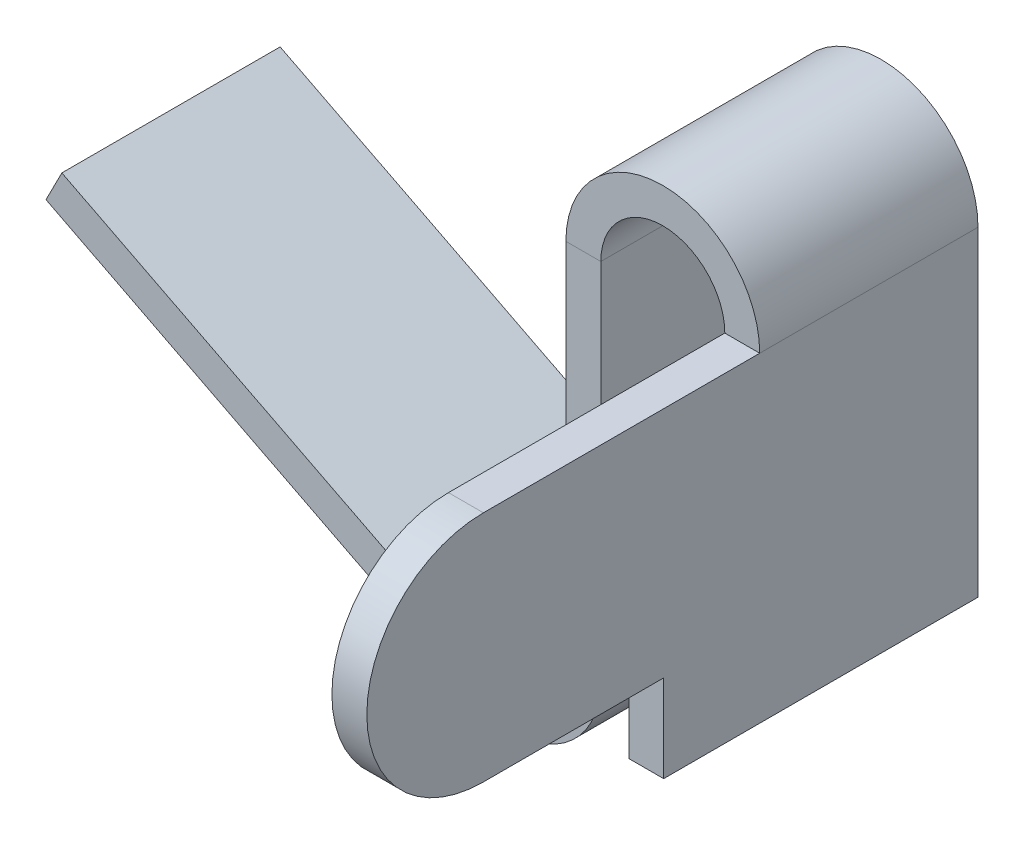
ISO-10303-21;
HEADER;
FILE_DESCRIPTION(('STEP AP214'),'2;1');
FILE_NAME('part.step','',(''),(''),'','','');
FILE_SCHEMA(('AUTOMOTIVE_DESIGN { 1 0 10303 214 1 1 1 1 }'));
ENDSEC;
DATA;
#1=APPLICATION_CONTEXT('core data for automotive mechanical design processes');
#2=APPLICATION_PROTOCOL_DEFINITION('international standard','automotive_design',2000,#1);
#3=PRODUCT_CONTEXT('',#1,'mechanical');
#4=PRODUCT('Part','Part','',(#3));
#5=PRODUCT_RELATED_PRODUCT_CATEGORY('part','',(#4));
#6=PRODUCT_DEFINITION_FORMATION('','',#4);
#7=PRODUCT_DEFINITION_CONTEXT('part definition',#1,'design');
#8=PRODUCT_DEFINITION('design','',#6,#7);
#9=PRODUCT_DEFINITION_SHAPE('','',#8);
#10=(LENGTH_UNIT() NAMED_UNIT(*) SI_UNIT(.MILLI.,.METRE.));
#11=(NAMED_UNIT(*) PLANE_ANGLE_UNIT() SI_UNIT($,.RADIAN.));
#12=(NAMED_UNIT(*) SI_UNIT($,.STERADIAN.) SOLID_ANGLE_UNIT());
#13=UNCERTAINTY_MEASURE_WITH_UNIT(LENGTH_MEASURE(1.E-05),#10,'distance_accuracy_value','');
#14=(GEOMETRIC_REPRESENTATION_CONTEXT(3) GLOBAL_UNCERTAINTY_ASSIGNED_CONTEXT((#13)) GLOBAL_UNIT_ASSIGNED_CONTEXT((#10,
#11,#12)) REPRESENTATION_CONTEXT('',''));
#15=CARTESIAN_POINT('',(0.,0.,0.));
#16=DIRECTION('',(0.,0.,1.));
#17=DIRECTION('',(1.,0.,0.));
#18=AXIS2_PLACEMENT_3D('',#15,#16,#17);
#19=CARTESIAN_POINT('',(1.11,0.5,5.665));
#20=DIRECTION('',(-1.,0.,0.));
#21=DIRECTION('',(0.,0.,1.));
#22=AXIS2_PLACEMENT_3D('',#19,#20,#21);
#23=CYLINDRICAL_SURFACE('',#22,1.335);
#24=DIRECTION('',(1.,0.,0.));
#25=VECTOR('',#24,1.);
#26=CARTESIAN_POINT('',(1.11,-0.835,5.665));
#27=LINE('',#26,#25);
#28=CARTESIAN_POINT('',(1.11,-0.835,5.665));
#29=VERTEX_POINT('',#28);
#30=CARTESIAN_POINT('',(0.710000000000001,-0.835,5.665));
#31=VERTEX_POINT('',#30);
#32=EDGE_CURVE('E238',#29,#31,#27,.F.);
#33=ORIENTED_EDGE('',*,*,#32,.F.);
#34=CARTESIAN_POINT('',(1.11,0.5,5.665));
#35=DIRECTION('',(-1.,0.,0.));
#36=DIRECTION('',(0.,0.,1.));
#37=AXIS2_PLACEMENT_3D('',#34,#35,#36);
#38=CIRCLE('',#37,1.335);
#39=CARTESIAN_POINT('',(1.11,1.835,5.665));
#40=VERTEX_POINT('',#39);
#41=EDGE_CURVE('E55',#40,#29,#38,.F.);
#42=ORIENTED_EDGE('',*,*,#41,.F.);
#43=DIRECTION('',(1.,0.,0.));
#44=VECTOR('',#43,1.);
#45=CARTESIAN_POINT('',(1.11,1.835,5.665));
#46=LINE('',#45,#44);
#47=CARTESIAN_POINT('',(0.710000000000001,1.835,5.665));
#48=VERTEX_POINT('',#47);
#49=EDGE_CURVE('E242',#48,#40,#46,.T.);
#50=ORIENTED_EDGE('',*,*,#49,.F.);
#51=CARTESIAN_POINT('',(0.710000000000001,0.5,5.665));
#52=DIRECTION('',(-1.,0.,0.));
#53=DIRECTION('',(0.,0.,1.));
#54=AXIS2_PLACEMENT_3D('',#51,#52,#53);
#55=CIRCLE('',#54,1.335);
#56=EDGE_CURVE('E11',#31,#48,#55,.T.);
#57=ORIENTED_EDGE('',*,*,#56,.F.);
#58=EDGE_LOOP('',(#33,#42,#50,#57));
#59=FACE_BOUND('',#58,.T.);
#60=ADVANCED_FACE('F46',(#59),#23,.T.);
#61=CARTESIAN_POINT('',(-0.710000000000001,1.835,2.5));
#62=DIRECTION('',(0.,0.,1.));
#63=DIRECTION('',(1.,0.,0.));
#64=AXIS2_PLACEMENT_3D('',#61,#62,#63);
#65=PLANE('',#64);
#66=DIRECTION('',(-1.,0.,0.));
#67=VECTOR('',#66,1.);
#68=CARTESIAN_POINT('',(-0.710000000000001,1.835,2.5));
#69=LINE('',#68,#67);
#70=CARTESIAN_POINT('',(-0.710000000000001,1.835,2.5));
#71=VERTEX_POINT('',#70);
#72=CARTESIAN_POINT('',(-1.11,1.835,2.5));
#73=VERTEX_POINT('',#72);
#74=EDGE_CURVE('E235',#71,#73,#69,.T.);
#75=ORIENTED_EDGE('',*,*,#74,.F.);
#76=CARTESIAN_POINT('',(0.,1.835,2.5));
#77=DIRECTION('',(0.,0.,1.));
#78=DIRECTION('',(1.,0.,0.));
#79=AXIS2_PLACEMENT_3D('',#76,#77,#78);
#80=CIRCLE('',#79,0.710000000000001);
#81=CARTESIAN_POINT('',(0.710000000000001,1.835,2.5));
#82=VERTEX_POINT('',#81);
#83=EDGE_CURVE('E285',#82,#71,#80,.T.);
#84=ORIENTED_EDGE('',*,*,#83,.F.);
#85=DIRECTION('',(-1.,0.,0.));
#86=VECTOR('',#85,1.);
#87=CARTESIAN_POINT('',(1.11,1.835,2.5));
#88=LINE('',#87,#86);
#89=CARTESIAN_POINT('',(1.11,1.835,2.5));
#90=VERTEX_POINT('',#89);
#91=EDGE_CURVE('E231',#90,#82,#88,.T.);
#92=ORIENTED_EDGE('',*,*,#91,.F.);
#93=CARTESIAN_POINT('',(0.,1.835,2.5));
#94=DIRECTION('',(0.,0.,1.));
#95=DIRECTION('',(1.,0.,0.));
#96=AXIS2_PLACEMENT_3D('',#93,#94,#95);
#97=CIRCLE('',#96,1.11);
#98=EDGE_CURVE('E289',#90,#73,#97,.T.);
#99=ORIENTED_EDGE('',*,*,#98,.T.);
#100=EDGE_LOOP('',(#75,#84,#92,#99));
#101=FACE_BOUND('',#100,.T.);
#102=ADVANCED_FACE('F403',(#101),#65,.T.);
#103=CARTESIAN_POINT('',(1.11,1.835,2.5));
#104=DIRECTION('',(0.,0.,1.));
#105=DIRECTION('',(1.,0.,0.));
#106=AXIS2_PLACEMENT_3D('',#103,#104,#105);
#107=PLANE('',#106);
#108=DIRECTION('',(0.,-1.,0.));
#109=VECTOR('',#108,1.);
#110=CARTESIAN_POINT('',(-0.710000000000001,1.835,2.5));
#111=LINE('',#110,#109);
#112=CARTESIAN_POINT('',(-0.710000000000001,-2.335,2.5));
#113=VERTEX_POINT('',#112);
#114=EDGE_CURVE('E281',#71,#113,#111,.T.);
#115=ORIENTED_EDGE('',*,*,#114,.F.);
#116=ORIENTED_EDGE('',*,*,#74,.T.);
#117=DIRECTION('',(0.,1.,0.));
#118=VECTOR('',#117,1.);
#119=CARTESIAN_POINT('',(-1.11,1.835,2.5));
#120=LINE('',#119,#118);
#121=CARTESIAN_POINT('',(-1.11,-2.335,2.5));
#122=VERTEX_POINT('',#121);
#123=EDGE_CURVE('E293',#73,#122,#120,.F.);
#124=ORIENTED_EDGE('',*,*,#123,.T.);
#125=DIRECTION('',(1.,0.,0.));
#126=VECTOR('',#125,1.);
#127=CARTESIAN_POINT('',(-1.11,-2.335,2.5));
#128=LINE('',#127,#126);
#129=EDGE_CURVE('E219',#122,#113,#128,.T.);
#130=ORIENTED_EDGE('',*,*,#129,.T.);
#131=EDGE_LOOP('',(#115,#116,#124,#130));
#132=FACE_BOUND('',#131,.T.);
#133=ADVANCED_FACE('F399',(#132),#107,.T.);
#134=CARTESIAN_POINT('',(0.710000000000001,1.835,0.));
#135=DIRECTION('',(0.,0.,-1.));
#136=DIRECTION('',(-1.,0.,0.));
#137=AXIS2_PLACEMENT_3D('',#134,#135,#136);
#138=PLANE('',#137);
#139=DIRECTION('',(1.,0.,0.));
#140=VECTOR('',#139,1.);
#141=CARTESIAN_POINT('',(0.710000000000001,1.835,0.));
#142=LINE('',#141,#140);
#143=CARTESIAN_POINT('',(0.710000000000001,1.835,0.));
#144=VERTEX_POINT('',#143);
#145=CARTESIAN_POINT('',(1.11,1.835,0.));
#146=VERTEX_POINT('',#145);
#147=EDGE_CURVE('E228',#144,#146,#142,.T.);
#148=ORIENTED_EDGE('',*,*,#147,.F.);
#149=CARTESIAN_POINT('',(0.,1.835,0.));
#150=DIRECTION('',(0.,0.,1.));
#151=DIRECTION('',(1.,0.,0.));
#152=AXIS2_PLACEMENT_3D('',#149,#150,#151);
#153=CIRCLE('',#152,0.710000000000001);
#154=CARTESIAN_POINT('',(-0.710000000000001,1.835,0.));
#155=VERTEX_POINT('',#154);
#156=EDGE_CURVE('E321',#144,#155,#153,.T.);
#157=ORIENTED_EDGE('',*,*,#156,.T.);
#158=DIRECTION('',(1.,0.,0.));
#159=VECTOR('',#158,1.);
#160=CARTESIAN_POINT('',(-1.11,1.835,0.));
#161=LINE('',#160,#159);
#162=CARTESIAN_POINT('',(-1.11,1.835,0.));
#163=VERTEX_POINT('',#162);
#164=EDGE_CURVE('E225',#163,#155,#161,.T.);
#165=ORIENTED_EDGE('',*,*,#164,.F.);
#166=CARTESIAN_POINT('',(0.,1.835,0.));
#167=DIRECTION('',(0.,0.,1.));
#168=DIRECTION('',(1.,0.,0.));
#169=AXIS2_PLACEMENT_3D('',#166,#167,#168);
#170=CIRCLE('',#169,1.11);
#171=EDGE_CURVE('E334',#146,#163,#170,.T.);
#172=ORIENTED_EDGE('',*,*,#171,.F.);
#173=EDGE_LOOP('',(#148,#157,#165,#172));
#174=FACE_BOUND('',#173,.T.);
#175=ADVANCED_FACE('F407',(#174),#138,.T.);
#176=CARTESIAN_POINT('',(-1.11,1.835,0.));
#177=DIRECTION('',(0.,0.,-1.));
#178=DIRECTION('',(-1.,0.,0.));
#179=AXIS2_PLACEMENT_3D('',#176,#177,#178);
#180=PLANE('',#179);
#181=DIRECTION('',(0.,1.,0.));
#182=VECTOR('',#181,1.);
#183=CARTESIAN_POINT('',(0.710000000000001,-1.835,0.));
#184=LINE('',#183,#182);
#185=CARTESIAN_POINT('',(0.710000000000001,-1.835,0.));
#186=VERTEX_POINT('',#185);
#187=EDGE_CURVE('E325',#186,#144,#184,.T.);
#188=ORIENTED_EDGE('',*,*,#187,.T.);
#189=ORIENTED_EDGE('',*,*,#147,.T.);
#190=DIRECTION('',(0.,1.,0.));
#191=VECTOR('',#190,1.);
#192=CARTESIAN_POINT('',(1.11,-1.835,0.));
#193=LINE('',#192,#191);
#194=CARTESIAN_POINT('',(1.11,-1.835,0.));
#195=VERTEX_POINT('',#194);
#196=EDGE_CURVE('E331',#195,#146,#193,.T.);
#197=ORIENTED_EDGE('',*,*,#196,.F.);
#198=DIRECTION('',(-1.,0.,0.));
#199=VECTOR('',#198,1.);
#200=CARTESIAN_POINT('',(1.11,-1.835,0.));
#201=LINE('',#200,#199);
#202=EDGE_CURVE('E178',#195,#186,#201,.T.);
#203=ORIENTED_EDGE('',*,*,#202,.T.);
#204=EDGE_LOOP('',(#188,#189,#197,#203));
#205=FACE_BOUND('',#204,.T.);
#206=ADVANCED_FACE('F414',(#205),#180,.T.);
#207=CARTESIAN_POINT('',(-2.16399049973955,-3.22600652418837,2.5));
#208=DIRECTION('',(0.,0.,1.));
#209=DIRECTION('',(1.,0.,0.));
#210=AXIS2_PLACEMENT_3D('',#207,#208,#209);
#211=PLANE('',#210);
#212=DIRECTION('',(0.453990499739551,0.891006524188366,0.));
#213=VECTOR('',#212,1.);
#214=CARTESIAN_POINT('',(-2.16399049973955,-3.22600652418837,2.5));
#215=LINE('',#214,#213);
#216=CARTESIAN_POINT('',(-2.16399049973955,-3.22600652418837,2.5));
#217=VERTEX_POINT('',#216);
#218=CARTESIAN_POINT('',(-1.98239429984373,-2.86960391451302,2.5));
#219=VERTEX_POINT('',#218);
#220=EDGE_CURVE('E222',#217,#219,#215,.T.);
#221=ORIENTED_EDGE('',*,*,#220,.F.);
#222=CARTESIAN_POINT('',(-1.71,-2.335,2.5));
#223=DIRECTION('',(0.,0.,-1.));
#224=DIRECTION('',(-1.,0.,0.));
#225=AXIS2_PLACEMENT_3D('',#222,#223,#224);
#226=CIRCLE('',#225,1.);
#227=EDGE_CURVE('E277',#113,#217,#226,.T.);
#228=ORIENTED_EDGE('',*,*,#227,.F.);
#229=ORIENTED_EDGE('',*,*,#129,.F.);
#230=CARTESIAN_POINT('',(-1.71,-2.335,2.5));
#231=DIRECTION('',(0.,0.,1.));
#232=DIRECTION('',(1.,0.,0.));
#233=AXIS2_PLACEMENT_3D('',#230,#231,#232);
#234=CIRCLE('',#233,0.6);
#235=EDGE_CURVE('E297',#122,#219,#234,.F.);
#236=ORIENTED_EDGE('',*,*,#235,.T.);
#237=EDGE_LOOP('',(#221,#228,#229,#236));
#238=FACE_BOUND('',#237,.T.);
#239=ADVANCED_FACE('F397',(#238),#211,.T.);
#240=CARTESIAN_POINT('',(-1.11,-2.335,2.5));
#241=DIRECTION('',(0.,0.,1.));
#242=DIRECTION('',(1.,0.,0.));
#243=AXIS2_PLACEMENT_3D('',#240,#241,#242);
#244=PLANE('',#243);
#245=DIRECTION('',(-0.891006524188366,0.453990499739551,0.));
#246=VECTOR('',#245,1.);
#247=CARTESIAN_POINT('',(-2.16399049973955,-3.22600652418837,2.5));
#248=LINE('',#247,#246);
#249=CARTESIAN_POINT('',(-7.06452638277556,-0.729058775620838,2.5));
#250=VERTEX_POINT('',#249);
#251=EDGE_CURVE('E273',#217,#250,#248,.T.);
#252=ORIENTED_EDGE('',*,*,#251,.F.);
#253=ORIENTED_EDGE('',*,*,#220,.T.);
#254=DIRECTION('',(-0.891006524188366,0.453990499739551,0.));
#255=VECTOR('',#254,1.);
#256=CARTESIAN_POINT('',(-1.98239429984373,-2.86960391451302,2.5));
#257=LINE('',#256,#255);
#258=CARTESIAN_POINT('',(-6.88293018287974,-0.372656165945492,2.5));
#259=VERTEX_POINT('',#258);
#260=EDGE_CURVE('E265',#219,#259,#257,.T.);
#261=ORIENTED_EDGE('',*,*,#260,.T.);
#262=DIRECTION('',(0.453990499739549,0.891006524188367,0.));
#263=VECTOR('',#262,1.);
#264=CARTESIAN_POINT('',(-7.06452638277556,-0.729058775620838,2.5));
#265=LINE('',#264,#263);
#266=EDGE_CURVE('E268',#250,#259,#265,.T.);
#267=ORIENTED_EDGE('',*,*,#266,.F.);
#268=EDGE_LOOP('',(#252,#253,#261,#267));
#269=FACE_BOUND('',#268,.T.);
#270=ADVANCED_FACE('F395',(#269),#244,.T.);
#271=CARTESIAN_POINT('',(-0.710000000000001,-2.335,0.));
#272=DIRECTION('',(0.,0.,-1.));
#273=DIRECTION('',(-1.,0.,0.));
#274=AXIS2_PLACEMENT_3D('',#271,#272,#273);
#275=PLANE('',#274);
#276=DIRECTION('',(-1.,0.,0.));
#277=VECTOR('',#276,1.);
#278=CARTESIAN_POINT('',(-0.710000000000001,-2.335,0.));
#279=LINE('',#278,#277);
#280=CARTESIAN_POINT('',(-0.710000000000001,-2.335,0.));
#281=VERTEX_POINT('',#280);
#282=CARTESIAN_POINT('',(-1.11,-2.335,0.));
#283=VERTEX_POINT('',#282);
#284=EDGE_CURVE('E216',#281,#283,#279,.T.);
#285=ORIENTED_EDGE('',*,*,#284,.F.);
#286=CARTESIAN_POINT('',(-1.71,-2.335,0.));
#287=DIRECTION('',(0.,0.,-1.));
#288=DIRECTION('',(-1.,0.,0.));
#289=AXIS2_PLACEMENT_3D('',#286,#287,#288);
#290=CIRCLE('',#289,1.);
#291=CARTESIAN_POINT('',(-2.16399049973955,-3.22600652418837,0.));
#292=VERTEX_POINT('',#291);
#293=EDGE_CURVE('E313',#281,#292,#290,.T.);
#294=ORIENTED_EDGE('',*,*,#293,.T.);
#295=DIRECTION('',(-0.453990499739551,-0.891006524188366,0.));
#296=VECTOR('',#295,1.);
#297=CARTESIAN_POINT('',(-1.98239429984373,-2.86960391451302,0.));
#298=LINE('',#297,#296);
#299=CARTESIAN_POINT('',(-1.98239429984373,-2.86960391451302,0.));
#300=VERTEX_POINT('',#299);
#301=EDGE_CURVE('E213',#300,#292,#298,.T.);
#302=ORIENTED_EDGE('',*,*,#301,.F.);
#303=CARTESIAN_POINT('',(-1.71,-2.335,0.));
#304=DIRECTION('',(0.,0.,1.));
#305=DIRECTION('',(1.,0.,0.));
#306=AXIS2_PLACEMENT_3D('',#303,#304,#305);
#307=CIRCLE('',#306,0.6);
#308=EDGE_CURVE('E269',#283,#300,#307,.F.);
#309=ORIENTED_EDGE('',*,*,#308,.F.);
#310=EDGE_LOOP('',(#285,#294,#302,#309));
#311=FACE_BOUND('',#310,.T.);
#312=ADVANCED_FACE('F366',(#311),#275,.T.);
#313=CARTESIAN_POINT('',(-1.98239429984373,-2.86960391451302,0.));
#314=DIRECTION('',(0.,0.,-1.));
#315=DIRECTION('',(-1.,0.,0.));
#316=AXIS2_PLACEMENT_3D('',#313,#314,#315);
#317=PLANE('',#316);
#318=DIRECTION('',(0.,-1.,0.));
#319=VECTOR('',#318,1.);
#320=CARTESIAN_POINT('',(-0.710000000000001,1.835,0.));
#321=LINE('',#320,#319);
#322=EDGE_CURVE('E317',#155,#281,#321,.T.);
#323=ORIENTED_EDGE('',*,*,#322,.T.);
#324=ORIENTED_EDGE('',*,*,#284,.T.);
#325=DIRECTION('',(0.,1.,0.));
#326=VECTOR('',#325,1.);
#327=CARTESIAN_POINT('',(-1.11,1.835,0.));
#328=LINE('',#327,#326);
#329=EDGE_CURVE('E338',#163,#283,#328,.F.);
#330=ORIENTED_EDGE('',*,*,#329,.F.);
#331=ORIENTED_EDGE('',*,*,#164,.T.);
#332=EDGE_LOOP('',(#323,#324,#330,#331));
#333=FACE_BOUND('',#332,.T.);
#334=ADVANCED_FACE('F362',(#333),#317,.T.);
#335=CARTESIAN_POINT('',(-1.98239429984373,-2.86960391451302,2.5));
#336=DIRECTION('',(-0.453990499739551,-0.891006524188366,0.));
#337=DIRECTION('',(0.891006524188366,-0.453990499739551,0.));
#338=AXIS2_PLACEMENT_3D('',#335,#336,#337);
#339=PLANE('',#338);
#340=DIRECTION('',(-0.891006524188366,0.453990499739551,0.));
#341=VECTOR('',#340,1.);
#342=CARTESIAN_POINT('',(-1.98239429984373,-2.86960391451302,0.));
#343=LINE('',#342,#341);
#344=CARTESIAN_POINT('',(-6.88293018287974,-0.372656165945492,0.));
#345=VERTEX_POINT('',#344);
#346=EDGE_CURVE('E264',#300,#345,#343,.T.);
#347=ORIENTED_EDGE('',*,*,#346,.T.);
#348=DIRECTION('',(0.,0.,-1.));
#349=VECTOR('',#348,1.);
#350=CARTESIAN_POINT('',(-6.88293018287974,-0.372656165945492,2.5));
#351=LINE('',#350,#349);
#352=EDGE_CURVE('E210',#259,#345,#351,.T.);
#353=ORIENTED_EDGE('',*,*,#352,.F.);
#354=ORIENTED_EDGE('',*,*,#260,.F.);
#355=DIRECTION('',(0.,0.,-1.));
#356=VECTOR('',#355,1.);
#357=CARTESIAN_POINT('',(-1.98239429984373,-2.86960391451302,2.5));
#358=LINE('',#357,#356);
#359=EDGE_CURVE('E301',#219,#300,#358,.T.);
#360=ORIENTED_EDGE('',*,*,#359,.T.);
#361=EDGE_LOOP('',(#347,#353,#354,#360));
#362=FACE_BOUND('',#361,.T.);
#363=ADVANCED_FACE('F391',(#362),#339,.F.);
#364=CARTESIAN_POINT('',(-7.06452638277556,-0.729058775620838,2.5));
#365=DIRECTION('',(-0.891006524188367,0.453990499739549,0.));
#366=DIRECTION('',(-0.453990499739549,-0.891006524188367,0.));
#367=AXIS2_PLACEMENT_3D('',#364,#365,#366);
#368=PLANE('',#367);
#369=DIRECTION('',(0.453990499739549,0.891006524188367,0.));
#370=VECTOR('',#369,1.);
#371=CARTESIAN_POINT('',(-7.06452638277556,-0.729058775620838,0.));
#372=LINE('',#371,#370);
#373=CARTESIAN_POINT('',(-7.06452638277556,-0.729058775620838,0.));
#374=VERTEX_POINT('',#373);
#375=EDGE_CURVE('E305',#374,#345,#372,.T.);
#376=ORIENTED_EDGE('',*,*,#375,.F.);
#377=DIRECTION('',(0.,0.,-1.));
#378=VECTOR('',#377,1.);
#379=CARTESIAN_POINT('',(-7.06452638277556,-0.729058775620838,2.5));
#380=LINE('',#379,#378);
#381=EDGE_CURVE('E207',#250,#374,#380,.T.);
#382=ORIENTED_EDGE('',*,*,#381,.F.);
#383=ORIENTED_EDGE('',*,*,#266,.T.);
#384=ORIENTED_EDGE('',*,*,#352,.T.);
#385=EDGE_LOOP('',(#376,#382,#383,#384));
#386=FACE_BOUND('',#385,.T.);
#387=ADVANCED_FACE('F451',(#386),#368,.T.);
#388=CARTESIAN_POINT('',(-2.16399049973955,-3.22600652418837,2.5));
#389=DIRECTION('',(-0.453990499739551,-0.891006524188366,0.));
#390=DIRECTION('',(0.891006524188366,-0.453990499739551,0.));
#391=AXIS2_PLACEMENT_3D('',#388,#389,#390);
#392=PLANE('',#391);
#393=DIRECTION('',(-0.891006524188366,0.453990499739551,0.));
#394=VECTOR('',#393,1.);
#395=CARTESIAN_POINT('',(-2.16399049973955,-3.22600652418837,0.));
#396=LINE('',#395,#394);
#397=EDGE_CURVE('E309',#292,#374,#396,.T.);
#398=ORIENTED_EDGE('',*,*,#397,.F.);
#399=DIRECTION('',(0.,0.,-1.));
#400=VECTOR('',#399,1.);
#401=CARTESIAN_POINT('',(-2.16399049973955,-3.22600652418837,2.5));
#402=LINE('',#401,#400);
#403=EDGE_CURVE('E203',#217,#292,#402,.T.);
#404=ORIENTED_EDGE('',*,*,#403,.F.);
#405=ORIENTED_EDGE('',*,*,#251,.T.);
#406=ORIENTED_EDGE('',*,*,#381,.T.);
#407=EDGE_LOOP('',(#398,#404,#405,#406));
#408=FACE_BOUND('',#407,.T.);
#409=ADVANCED_FACE('F380',(#408),#392,.T.);
#410=CARTESIAN_POINT('',(-1.71,-2.335,2.5));
#411=DIRECTION('',(0.,0.,-1.));
#412=DIRECTION('',(-1.,0.,0.));
#413=AXIS2_PLACEMENT_3D('',#410,#411,#412);
#414=CYLINDRICAL_SURFACE('',#413,1.);
#415=ORIENTED_EDGE('',*,*,#293,.F.);
#416=DIRECTION('',(0.,0.,-1.));
#417=VECTOR('',#416,1.);
#418=CARTESIAN_POINT('',(-0.710000000000001,-2.335,2.5));
#419=LINE('',#418,#417);
#420=EDGE_CURVE('E199',#113,#281,#419,.T.);
#421=ORIENTED_EDGE('',*,*,#420,.F.);
#422=ORIENTED_EDGE('',*,*,#227,.T.);
#423=ORIENTED_EDGE('',*,*,#403,.T.);
#424=EDGE_LOOP('',(#415,#421,#422,#423));
#425=FACE_BOUND('',#424,.T.);
#426=ADVANCED_FACE('F375',(#425),#414,.T.);
#427=CARTESIAN_POINT('',(-0.710000000000001,1.835,2.5));
#428=DIRECTION('',(1.,0.,0.));
#429=DIRECTION('',(0.,0.,-1.));
#430=AXIS2_PLACEMENT_3D('',#427,#428,#429);
#431=PLANE('',#430);
#432=ORIENTED_EDGE('',*,*,#322,.F.);
#433=DIRECTION('',(0.,0.,-1.));
#434=VECTOR('',#433,1.);
#435=CARTESIAN_POINT('',(-0.710000000000001,1.835,2.5));
#436=LINE('',#435,#434);
#437=EDGE_CURVE('E195',#71,#155,#436,.T.);
#438=ORIENTED_EDGE('',*,*,#437,.F.);
#439=ORIENTED_EDGE('',*,*,#114,.T.);
#440=ORIENTED_EDGE('',*,*,#420,.T.);
#441=EDGE_LOOP('',(#432,#438,#439,#440));
#442=FACE_BOUND('',#441,.T.);
#443=ADVANCED_FACE('F370',(#442),#431,.T.);
#444=CARTESIAN_POINT('',(0.,1.835,2.5));
#445=DIRECTION('',(0.,0.,-1.));
#446=DIRECTION('',(-1.,0.,0.));
#447=AXIS2_PLACEMENT_3D('',#444,#445,#446);
#448=CYLINDRICAL_SURFACE('',#447,0.710000000000001);
#449=ORIENTED_EDGE('',*,*,#156,.F.);
#450=DIRECTION('',(0.,0.,-1.));
#451=VECTOR('',#450,1.);
#452=CARTESIAN_POINT('',(0.710000000000001,1.835,2.5));
#453=LINE('',#452,#451);
#454=EDGE_CURVE('E185',#82,#144,#453,.T.);
#455=ORIENTED_EDGE('',*,*,#454,.F.);
#456=ORIENTED_EDGE('',*,*,#83,.T.);
#457=ORIENTED_EDGE('',*,*,#437,.T.);
#458=EDGE_LOOP('',(#449,#455,#456,#457));
#459=FACE_BOUND('',#458,.T.);
#460=ADVANCED_FACE('F411',(#459),#448,.F.);
#461=CARTESIAN_POINT('',(0.710000000000001,-1.835,2.5));
#462=DIRECTION('',(-1.,0.,0.));
#463=DIRECTION('',(0.,0.,1.));
#464=AXIS2_PLACEMENT_3D('',#461,#462,#463);
#465=PLANE('',#464);
#466=DIRECTION('',(0.,0.,-1.));
#467=VECTOR('',#466,1.);
#468=CARTESIAN_POINT('',(0.710000000000001,-0.835,2.5));
#469=LINE('',#468,#467);
#470=CARTESIAN_POINT('',(0.710000000000001,-0.835,3.6));
#471=VERTEX_POINT('',#470);
#472=EDGE_CURVE('E253',#31,#471,#469,.T.);
#473=ORIENTED_EDGE('',*,*,#472,.F.);
#474=ORIENTED_EDGE('',*,*,#56,.T.);
#475=DIRECTION('',(0.,0.,-1.));
#476=VECTOR('',#475,1.);
#477=CARTESIAN_POINT('',(0.710000000000001,1.835,7.));
#478=LINE('',#477,#476);
#479=EDGE_CURVE('E259',#48,#82,#478,.T.);
#480=ORIENTED_EDGE('',*,*,#479,.T.);
#481=ORIENTED_EDGE('',*,*,#454,.T.);
#482=ORIENTED_EDGE('',*,*,#187,.F.);
#483=DIRECTION('',(0.,0.,-1.));
#484=VECTOR('',#483,1.);
#485=CARTESIAN_POINT('',(0.710000000000001,-1.835,2.5));
#486=LINE('',#485,#484);
#487=CARTESIAN_POINT('',(0.710000000000001,-1.835,3.6));
#488=VERTEX_POINT('',#487);
#489=EDGE_CURVE('E180',#488,#186,#486,.T.);
#490=ORIENTED_EDGE('',*,*,#489,.F.);
#491=DIRECTION('',(0.,-1.,0.));
#492=VECTOR('',#491,1.);
#493=CARTESIAN_POINT('',(0.710000000000001,-1.835,3.6));
#494=LINE('',#493,#492);
#495=EDGE_CURVE('E158',#471,#488,#494,.T.);
#496=ORIENTED_EDGE('',*,*,#495,.F.);
#497=EDGE_LOOP('',(#473,#474,#480,#481,#482,#490,#496));
#498=FACE_BOUND('',#497,.T.);
#499=ADVANCED_FACE('F415',(#498),#465,.T.);
#500=CARTESIAN_POINT('',(1.11,-1.835,2.5));
#501=DIRECTION('',(0.,-1.,0.));
#502=DIRECTION('',(0.,0.,-1.));
#503=AXIS2_PLACEMENT_3D('',#500,#501,#502);
#504=PLANE('',#503);
#505=DIRECTION('',(1.,0.,0.));
#506=VECTOR('',#505,1.);
#507=CARTESIAN_POINT('',(-7.06452638277556,-1.835,3.6));
#508=LINE('',#507,#506);
#509=CARTESIAN_POINT('',(1.11,-1.835,3.6));
#510=VERTEX_POINT('',#509);
#511=EDGE_CURVE('E151',#488,#510,#508,.T.);
#512=ORIENTED_EDGE('',*,*,#511,.F.);
#513=ORIENTED_EDGE('',*,*,#489,.T.);
#514=ORIENTED_EDGE('',*,*,#202,.F.);
#515=DIRECTION('',(0.,0.,-1.));
#516=VECTOR('',#515,1.);
#517=CARTESIAN_POINT('',(1.11,-1.835,2.5));
#518=LINE('',#517,#516);
#519=EDGE_CURVE('E170',#510,#195,#518,.T.);
#520=ORIENTED_EDGE('',*,*,#519,.F.);
#521=EDGE_LOOP('',(#512,#513,#514,#520));
#522=FACE_BOUND('',#521,.T.);
#523=ADVANCED_FACE('F176',(#522),#504,.T.);
#524=CARTESIAN_POINT('',(1.11,-1.835,2.5));
#525=DIRECTION('',(-1.,0.,0.));
#526=DIRECTION('',(0.,0.,1.));
#527=AXIS2_PLACEMENT_3D('',#524,#525,#526);
#528=PLANE('',#527);
#529=DIRECTION('',(0.,0.,-1.));
#530=VECTOR('',#529,1.);
#531=CARTESIAN_POINT('',(1.11,1.835,7.));
#532=LINE('',#531,#530);
#533=EDGE_CURVE('E246',#40,#90,#532,.T.);
#534=ORIENTED_EDGE('',*,*,#533,.F.);
#535=ORIENTED_EDGE('',*,*,#41,.T.);
#536=DIRECTION('',(0.,0.,1.));
#537=VECTOR('',#536,1.);
#538=CARTESIAN_POINT('',(1.11,-0.835,7.));
#539=LINE('',#538,#537);
#540=CARTESIAN_POINT('',(1.11,-0.835,3.6));
#541=VERTEX_POINT('',#540);
#542=EDGE_CURVE('E164',#541,#29,#539,.T.);
#543=ORIENTED_EDGE('',*,*,#542,.F.);
#544=DIRECTION('',(0.,1.,0.));
#545=VECTOR('',#544,1.);
#546=CARTESIAN_POINT('',(1.11,-1.835,3.6));
#547=LINE('',#546,#545);
#548=EDGE_CURVE('E155',#510,#541,#547,.T.);
#549=ORIENTED_EDGE('',*,*,#548,.F.);
#550=ORIENTED_EDGE('',*,*,#519,.T.);
#551=ORIENTED_EDGE('',*,*,#196,.T.);
#552=DIRECTION('',(0.,0.,-1.));
#553=VECTOR('',#552,1.);
#554=CARTESIAN_POINT('',(1.11,1.835,2.5));
#555=LINE('',#554,#553);
#556=EDGE_CURVE('E181',#90,#146,#555,.T.);
#557=ORIENTED_EDGE('',*,*,#556,.F.);
#558=EDGE_LOOP('',(#534,#535,#543,#549,#550,#551,#557));
#559=FACE_BOUND('',#558,.T.);
#560=ADVANCED_FACE('F168',(#559),#528,.F.);
#561=CARTESIAN_POINT('',(0.,1.835,2.5));
#562=DIRECTION('',(0.,0.,-1.));
#563=DIRECTION('',(-1.,0.,0.));
#564=AXIS2_PLACEMENT_3D('',#561,#562,#563);
#565=CYLINDRICAL_SURFACE('',#564,1.11);
#566=ORIENTED_EDGE('',*,*,#171,.T.);
#567=DIRECTION('',(0.,0.,-1.));
#568=VECTOR('',#567,1.);
#569=CARTESIAN_POINT('',(-1.11,1.835,2.5));
#570=LINE('',#569,#568);
#571=EDGE_CURVE('E188',#73,#163,#570,.T.);
#572=ORIENTED_EDGE('',*,*,#571,.F.);
#573=ORIENTED_EDGE('',*,*,#98,.F.);
#574=ORIENTED_EDGE('',*,*,#556,.T.);
#575=EDGE_LOOP('',(#566,#572,#573,#574));
#576=FACE_BOUND('',#575,.T.);
#577=ADVANCED_FACE('F404',(#576),#565,.T.);
#578=CARTESIAN_POINT('',(-1.11,1.835,2.5));
#579=DIRECTION('',(1.,0.,0.));
#580=DIRECTION('',(0.,0.,-1.));
#581=AXIS2_PLACEMENT_3D('',#578,#579,#580);
#582=PLANE('',#581);
#583=ORIENTED_EDGE('',*,*,#329,.T.);
#584=DIRECTION('',(0.,0.,-1.));
#585=VECTOR('',#584,1.);
#586=CARTESIAN_POINT('',(-1.11,-2.335,2.5));
#587=LINE('',#586,#585);
#588=EDGE_CURVE('E348',#122,#283,#587,.T.);
#589=ORIENTED_EDGE('',*,*,#588,.F.);
#590=ORIENTED_EDGE('',*,*,#123,.F.);
#591=ORIENTED_EDGE('',*,*,#571,.T.);
#592=EDGE_LOOP('',(#583,#589,#590,#591));
#593=FACE_BOUND('',#592,.T.);
#594=ADVANCED_FACE('F357',(#593),#582,.F.);
#595=CARTESIAN_POINT('',(-1.71,-2.335,2.5));
#596=DIRECTION('',(0.,0.,-1.));
#597=DIRECTION('',(-1.,0.,0.));
#598=AXIS2_PLACEMENT_3D('',#595,#596,#597);
#599=CYLINDRICAL_SURFACE('',#598,0.6);
#600=ORIENTED_EDGE('',*,*,#308,.T.);
#601=ORIENTED_EDGE('',*,*,#359,.F.);
#602=ORIENTED_EDGE('',*,*,#235,.F.);
#603=ORIENTED_EDGE('',*,*,#588,.T.);
#604=EDGE_LOOP('',(#600,#601,#602,#603));
#605=FACE_BOUND('',#604,.T.);
#606=ADVANCED_FACE('F387',(#605),#599,.F.);
#607=CARTESIAN_POINT('',(-1.71,-2.335,0.));
#608=DIRECTION('',(0.,0.,-1.));
#609=DIRECTION('',(-1.,0.,0.));
#610=AXIS2_PLACEMENT_3D('',#607,#608,#609);
#611=PLANE('',#610);
#612=ORIENTED_EDGE('',*,*,#346,.F.);
#613=ORIENTED_EDGE('',*,*,#301,.T.);
#614=ORIENTED_EDGE('',*,*,#397,.T.);
#615=ORIENTED_EDGE('',*,*,#375,.T.);
#616=EDGE_LOOP('',(#612,#613,#614,#615));
#617=FACE_BOUND('',#616,.T.);
#618=ADVANCED_FACE('F384',(#617),#611,.T.);
#619=CARTESIAN_POINT('',(1.11,1.835,7.));
#620=DIRECTION('',(0.,-1.,0.));
#621=DIRECTION('',(1.,0.,0.));
#622=AXIS2_PLACEMENT_3D('',#619,#620,#621);
#623=PLANE('',#622);
#624=ORIENTED_EDGE('',*,*,#479,.F.);
#625=ORIENTED_EDGE('',*,*,#49,.T.);
#626=ORIENTED_EDGE('',*,*,#533,.T.);
#627=ORIENTED_EDGE('',*,*,#91,.T.);
#628=EDGE_LOOP('',(#624,#625,#626,#627));
#629=FACE_BOUND('',#628,.T.);
#630=ADVANCED_FACE('F418',(#629),#623,.F.);
#631=CARTESIAN_POINT('',(-7.06452638277556,-0.835,7.));
#632=DIRECTION('',(0.,1.,0.));
#633=DIRECTION('',(0.,0.,1.));
#634=AXIS2_PLACEMENT_3D('',#631,#632,#633);
#635=PLANE('',#634);
#636=ORIENTED_EDGE('',*,*,#542,.T.);
#637=ORIENTED_EDGE('',*,*,#32,.T.);
#638=ORIENTED_EDGE('',*,*,#472,.T.);
#639=DIRECTION('',(1.,0.,0.));
#640=VECTOR('',#639,1.);
#641=CARTESIAN_POINT('',(-7.06452638277556,-0.835,3.6));
#642=LINE('',#641,#640);
#643=EDGE_CURVE('E163',#471,#541,#642,.T.);
#644=ORIENTED_EDGE('',*,*,#643,.T.);
#645=EDGE_LOOP('',(#636,#637,#638,#644));
#646=FACE_BOUND('',#645,.T.);
#647=ADVANCED_FACE('F248',(#646),#635,.F.);
#648=CARTESIAN_POINT('',(-7.06452638277556,-1.835,3.6));
#649=DIRECTION('',(0.,0.,-1.));
#650=DIRECTION('',(-1.,0.,0.));
#651=AXIS2_PLACEMENT_3D('',#648,#649,#650);
#652=PLANE('',#651);
#653=ORIENTED_EDGE('',*,*,#495,.T.);
#654=ORIENTED_EDGE('',*,*,#511,.T.);
#655=ORIENTED_EDGE('',*,*,#548,.T.);
#656=ORIENTED_EDGE('',*,*,#643,.F.);
#657=EDGE_LOOP('',(#653,#654,#655,#656));
#658=FACE_BOUND('',#657,.T.);
#659=ADVANCED_FACE('F153',(#658),#652,.F.);
#660=CLOSED_SHELL('',(#60,#102,#133,#175,#206,#239,#270,#312,#334,#363,#387,#409,#426,#443,#460,
#499,#523,#560,#577,#594,#606,#618,#630,#647,#659));
#661=MANIFOLD_SOLID_BREP('B2',#660);
#662=ADVANCED_BREP_SHAPE_REPRESENTATION('',(#18,#661),#14);
#663=SHAPE_DEFINITION_REPRESENTATION(#9,#662);
ENDSEC;
END-ISO-10303-21;
